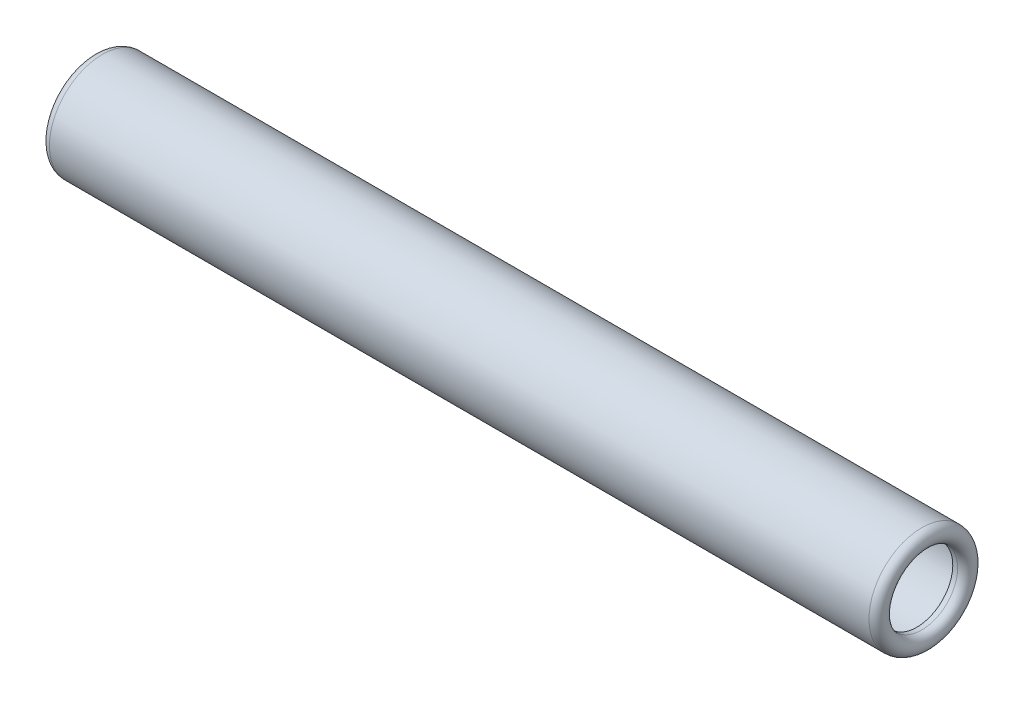
ISO-10303-21;
HEADER;
FILE_DESCRIPTION(('STEP AP214'),'2;1');
FILE_NAME('part.step','',(''),(''),'','','');
FILE_SCHEMA(('AUTOMOTIVE_DESIGN { 1 0 10303 214 1 1 1 1 }'));
ENDSEC;
DATA;
#1=APPLICATION_CONTEXT('core data for automotive mechanical design processes');
#2=APPLICATION_PROTOCOL_DEFINITION('international standard','automotive_design',2000,#1);
#3=PRODUCT_CONTEXT('',#1,'mechanical');
#4=PRODUCT('Part','Part','',(#3));
#5=PRODUCT_RELATED_PRODUCT_CATEGORY('part','',(#4));
#6=PRODUCT_DEFINITION_FORMATION('','',#4);
#7=PRODUCT_DEFINITION_CONTEXT('part definition',#1,'design');
#8=PRODUCT_DEFINITION('design','',#6,#7);
#9=PRODUCT_DEFINITION_SHAPE('','',#8);
#10=(LENGTH_UNIT() NAMED_UNIT(*) SI_UNIT(.MILLI.,.METRE.));
#11=(NAMED_UNIT(*) PLANE_ANGLE_UNIT() SI_UNIT($,.RADIAN.));
#12=(NAMED_UNIT(*) SI_UNIT($,.STERADIAN.) SOLID_ANGLE_UNIT());
#13=UNCERTAINTY_MEASURE_WITH_UNIT(LENGTH_MEASURE(1.E-05),#10,'distance_accuracy_value','');
#14=(GEOMETRIC_REPRESENTATION_CONTEXT(3) GLOBAL_UNCERTAINTY_ASSIGNED_CONTEXT((#13)) GLOBAL_UNIT_ASSIGNED_CONTEXT((#10,
#11,#12)) REPRESENTATION_CONTEXT('',''));
#15=CARTESIAN_POINT('',(0.,0.,0.));
#16=DIRECTION('',(0.,0.,1.));
#17=DIRECTION('',(1.,0.,0.));
#18=AXIS2_PLACEMENT_3D('',#15,#16,#17);
#19=CARTESIAN_POINT('',(298.95,0.,0.));
#20=DIRECTION('',(1.,0.,0.));
#21=DIRECTION('',(0.,1.,0.));
#22=AXIS2_PLACEMENT_3D('',#19,#20,#21);
#23=TOROIDAL_SURFACE('',#22,16.,3.05);
#24=CARTESIAN_POINT('',(298.95,0.,0.));
#25=DIRECTION('',(1.,0.,0.));
#26=DIRECTION('',(0.,1.,0.));
#27=AXIS2_PLACEMENT_3D('',#24,#25,#26);
#28=CIRCLE('',#27,19.05);
#29=CARTESIAN_POINT('',(298.95,19.05,0.));
#30=VERTEX_POINT('',#29);
#31=EDGE_CURVE('E73',#30,#30,#28,.T.);
#32=ORIENTED_EDGE('',*,*,#31,.T.);
#33=EDGE_LOOP('',(#32));
#34=FACE_BOUND('',#33,.T.);
#35=CARTESIAN_POINT('',(298.95,0.,0.));
#36=DIRECTION('',(1.,0.,0.));
#37=DIRECTION('',(0.,1.,0.));
#38=AXIS2_PLACEMENT_3D('',#35,#36,#37);
#39=CIRCLE('',#38,12.95);
#40=CARTESIAN_POINT('',(298.95,12.95,0.));
#41=VERTEX_POINT('',#40);
#42=EDGE_CURVE('E10',#41,#41,#39,.T.);
#43=ORIENTED_EDGE('',*,*,#42,.F.);
#44=EDGE_LOOP('',(#43));
#45=FACE_BOUND('',#44,.T.);
#46=ADVANCED_FACE('F33',(#34,#45),#23,.T.);
#47=CARTESIAN_POINT('',(307.5,0.,0.));
#48=DIRECTION('',(1.,0.,0.));
#49=DIRECTION('',(0.,1.,0.));
#50=AXIS2_PLACEMENT_3D('',#47,#48,#49);
#51=CYLINDRICAL_SURFACE('',#50,12.95);
#52=ORIENTED_EDGE('',*,*,#42,.T.);
#53=EDGE_LOOP('',(#52));
#54=FACE_BOUND('',#53,.T.);
#55=CARTESIAN_POINT('',(297.2,0.,0.));
#56=DIRECTION('',(1.,0.,0.));
#57=DIRECTION('',(0.,1.,0.));
#58=AXIS2_PLACEMENT_3D('',#55,#56,#57);
#59=CIRCLE('',#58,12.95);
#60=CARTESIAN_POINT('',(297.2,12.95,0.));
#61=VERTEX_POINT('',#60);
#62=EDGE_CURVE('E39',#61,#61,#59,.T.);
#63=ORIENTED_EDGE('',*,*,#62,.F.);
#64=EDGE_LOOP('',(#63));
#65=FACE_BOUND('',#64,.T.);
#66=ADVANCED_FACE('F91',(#54,#65),#51,.F.);
#67=CARTESIAN_POINT('',(297.2,12.95,0.));
#68=DIRECTION('',(-1.,0.,0.));
#69=DIRECTION('',(0.,-1.,0.));
#70=AXIS2_PLACEMENT_3D('',#67,#68,#69);
#71=PLANE('',#70);
#72=ORIENTED_EDGE('',*,*,#62,.T.);
#73=EDGE_LOOP('',(#72));
#74=FACE_BOUND('',#73,.T.);
#75=CARTESIAN_POINT('',(297.2,0.,0.));
#76=DIRECTION('',(1.,0.,0.));
#77=DIRECTION('',(0.,1.,0.));
#78=AXIS2_PLACEMENT_3D('',#75,#76,#77);
#79=CIRCLE('',#78,14.15);
#80=CARTESIAN_POINT('',(297.2,14.15,0.));
#81=VERTEX_POINT('',#80);
#82=EDGE_CURVE('E43',#81,#81,#79,.T.);
#83=ORIENTED_EDGE('',*,*,#82,.F.);
#84=EDGE_LOOP('',(#83));
#85=FACE_BOUND('',#84,.T.);
#86=ADVANCED_FACE('F95',(#74,#85),#71,.T.);
#87=CARTESIAN_POINT('',(307.5,0.,0.));
#88=DIRECTION('',(1.,0.,0.));
#89=DIRECTION('',(0.,1.,0.));
#90=AXIS2_PLACEMENT_3D('',#87,#88,#89);
#91=CYLINDRICAL_SURFACE('',#90,14.15);
#92=ORIENTED_EDGE('',*,*,#82,.T.);
#93=EDGE_LOOP('',(#92));
#94=FACE_BOUND('',#93,.T.);
#95=CARTESIAN_POINT('',(298.95,0.,0.));
#96=DIRECTION('',(1.,0.,0.));
#97=DIRECTION('',(0.,1.,0.));
#98=AXIS2_PLACEMENT_3D('',#95,#96,#97);
#99=CIRCLE('',#98,14.15);
#100=CARTESIAN_POINT('',(298.95,14.15,0.));
#101=VERTEX_POINT('',#100);
#102=EDGE_CURVE('E47',#101,#101,#99,.T.);
#103=ORIENTED_EDGE('',*,*,#102,.F.);
#104=EDGE_LOOP('',(#103));
#105=FACE_BOUND('',#104,.T.);
#106=ADVANCED_FACE('F99',(#94,#105),#91,.T.);
#107=CARTESIAN_POINT('',(298.95,0.,0.));
#108=DIRECTION('',(1.,0.,0.));
#109=DIRECTION('',(0.,1.,0.));
#110=AXIS2_PLACEMENT_3D('',#107,#108,#109);
#111=TOROIDAL_SURFACE('',#110,16.,1.85);
#112=ORIENTED_EDGE('',*,*,#102,.T.);
#113=EDGE_LOOP('',(#112));
#114=FACE_BOUND('',#113,.T.);
#115=CARTESIAN_POINT('',(298.95,0.,0.));
#116=DIRECTION('',(1.,0.,0.));
#117=DIRECTION('',(0.,1.,0.));
#118=AXIS2_PLACEMENT_3D('',#115,#116,#117);
#119=CIRCLE('',#118,17.85);
#120=CARTESIAN_POINT('',(298.95,17.85,0.));
#121=VERTEX_POINT('',#120);
#122=EDGE_CURVE('E52',#121,#121,#119,.T.);
#123=ORIENTED_EDGE('',*,*,#122,.F.);
#124=EDGE_LOOP('',(#123));
#125=FACE_BOUND('',#124,.T.);
#126=ADVANCED_FACE('F105',(#114,#125),#111,.F.);
#127=CARTESIAN_POINT('',(307.5,0.,0.));
#128=DIRECTION('',(1.,0.,0.));
#129=DIRECTION('',(0.,1.,0.));
#130=AXIS2_PLACEMENT_3D('',#127,#128,#129);
#131=CYLINDRICAL_SURFACE('',#130,17.85);
#132=ORIENTED_EDGE('',*,*,#122,.T.);
#133=EDGE_LOOP('',(#132));
#134=FACE_BOUND('',#133,.T.);
#135=CARTESIAN_POINT('',(3.05,0.,0.));
#136=DIRECTION('',(1.,0.,0.));
#137=DIRECTION('',(0.,1.,0.));
#138=AXIS2_PLACEMENT_3D('',#135,#136,#137);
#139=CIRCLE('',#138,17.85);
#140=CARTESIAN_POINT('',(3.04999999999999,17.85,0.));
#141=VERTEX_POINT('',#140);
#142=EDGE_CURVE('E55',#141,#141,#139,.T.);
#143=ORIENTED_EDGE('',*,*,#142,.F.);
#144=EDGE_LOOP('',(#143));
#145=FACE_BOUND('',#144,.T.);
#146=ADVANCED_FACE('F109',(#134,#145),#131,.F.);
#147=CARTESIAN_POINT('',(3.05,0.,0.));
#148=DIRECTION('',(1.,0.,0.));
#149=DIRECTION('',(0.,1.,0.));
#150=AXIS2_PLACEMENT_3D('',#147,#148,#149);
#151=TOROIDAL_SURFACE('',#150,16.,1.85);
#152=ORIENTED_EDGE('',*,*,#142,.T.);
#153=EDGE_LOOP('',(#152));
#154=FACE_BOUND('',#153,.T.);
#155=CARTESIAN_POINT('',(3.05,0.,0.));
#156=DIRECTION('',(1.,0.,0.));
#157=DIRECTION('',(0.,1.,0.));
#158=AXIS2_PLACEMENT_3D('',#155,#156,#157);
#159=CIRCLE('',#158,14.15);
#160=CARTESIAN_POINT('',(3.05,14.15,0.));
#161=VERTEX_POINT('',#160);
#162=EDGE_CURVE('E58',#161,#161,#159,.T.);
#163=ORIENTED_EDGE('',*,*,#162,.F.);
#164=EDGE_LOOP('',(#163));
#165=FACE_BOUND('',#164,.T.);
#166=ADVANCED_FACE('F113',(#154,#165),#151,.F.);
#167=CARTESIAN_POINT('',(307.5,0.,0.));
#168=DIRECTION('',(1.,0.,0.));
#169=DIRECTION('',(0.,1.,0.));
#170=AXIS2_PLACEMENT_3D('',#167,#168,#169);
#171=CYLINDRICAL_SURFACE('',#170,14.15);
#172=ORIENTED_EDGE('',*,*,#162,.T.);
#173=EDGE_LOOP('',(#172));
#174=FACE_BOUND('',#173,.T.);
#175=CARTESIAN_POINT('',(4.80000000000003,0.,0.));
#176=DIRECTION('',(1.,0.,0.));
#177=DIRECTION('',(0.,1.,0.));
#178=AXIS2_PLACEMENT_3D('',#175,#176,#177);
#179=CIRCLE('',#178,14.15);
#180=CARTESIAN_POINT('',(4.80000000000002,14.15,0.));
#181=VERTEX_POINT('',#180);
#182=EDGE_CURVE('E61',#181,#181,#179,.T.);
#183=ORIENTED_EDGE('',*,*,#182,.F.);
#184=EDGE_LOOP('',(#183));
#185=FACE_BOUND('',#184,.T.);
#186=ADVANCED_FACE('F117',(#174,#185),#171,.T.);
#187=CARTESIAN_POINT('',(4.8,12.95,0.));
#188=DIRECTION('',(1.,0.,0.));
#189=DIRECTION('',(0.,1.,0.));
#190=AXIS2_PLACEMENT_3D('',#187,#188,#189);
#191=PLANE('',#190);
#192=ORIENTED_EDGE('',*,*,#182,.T.);
#193=EDGE_LOOP('',(#192));
#194=FACE_BOUND('',#193,.T.);
#195=CARTESIAN_POINT('',(4.80000000000003,0.,0.));
#196=DIRECTION('',(1.,0.,0.));
#197=DIRECTION('',(0.,1.,0.));
#198=AXIS2_PLACEMENT_3D('',#195,#196,#197);
#199=CIRCLE('',#198,12.95);
#200=CARTESIAN_POINT('',(4.80000000000002,12.95,0.));
#201=VERTEX_POINT('',#200);
#202=EDGE_CURVE('E64',#201,#201,#199,.T.);
#203=ORIENTED_EDGE('',*,*,#202,.F.);
#204=EDGE_LOOP('',(#203));
#205=FACE_BOUND('',#204,.T.);
#206=ADVANCED_FACE('F121',(#194,#205),#191,.T.);
#207=CARTESIAN_POINT('',(307.5,0.,0.));
#208=DIRECTION('',(1.,0.,0.));
#209=DIRECTION('',(0.,1.,0.));
#210=AXIS2_PLACEMENT_3D('',#207,#208,#209);
#211=CYLINDRICAL_SURFACE('',#210,12.95);
#212=ORIENTED_EDGE('',*,*,#202,.T.);
#213=EDGE_LOOP('',(#212));
#214=FACE_BOUND('',#213,.T.);
#215=CARTESIAN_POINT('',(3.05,0.,0.));
#216=DIRECTION('',(1.,0.,0.));
#217=DIRECTION('',(0.,1.,0.));
#218=AXIS2_PLACEMENT_3D('',#215,#216,#217);
#219=CIRCLE('',#218,12.95);
#220=CARTESIAN_POINT('',(3.05,12.95,0.));
#221=VERTEX_POINT('',#220);
#222=EDGE_CURVE('E67',#221,#221,#219,.T.);
#223=ORIENTED_EDGE('',*,*,#222,.F.);
#224=EDGE_LOOP('',(#223));
#225=FACE_BOUND('',#224,.T.);
#226=ADVANCED_FACE('F87',(#214,#225),#211,.F.);
#227=CARTESIAN_POINT('',(3.05,0.,0.));
#228=DIRECTION('',(1.,0.,0.));
#229=DIRECTION('',(0.,1.,0.));
#230=AXIS2_PLACEMENT_3D('',#227,#228,#229);
#231=TOROIDAL_SURFACE('',#230,16.,3.05);
#232=ORIENTED_EDGE('',*,*,#222,.T.);
#233=EDGE_LOOP('',(#232));
#234=FACE_BOUND('',#233,.T.);
#235=CARTESIAN_POINT('',(3.05,0.,0.));
#236=DIRECTION('',(1.,0.,0.));
#237=DIRECTION('',(0.,1.,0.));
#238=AXIS2_PLACEMENT_3D('',#235,#236,#237);
#239=CIRCLE('',#238,19.05);
#240=CARTESIAN_POINT('',(3.04999999999999,19.05,0.));
#241=VERTEX_POINT('',#240);
#242=EDGE_CURVE('E70',#241,#241,#239,.T.);
#243=ORIENTED_EDGE('',*,*,#242,.F.);
#244=EDGE_LOOP('',(#243));
#245=FACE_BOUND('',#244,.T.);
#246=ADVANCED_FACE('F81',(#234,#245),#231,.T.);
#247=CARTESIAN_POINT('',(307.5,0.,0.));
#248=DIRECTION('',(1.,0.,0.));
#249=DIRECTION('',(0.,1.,0.));
#250=AXIS2_PLACEMENT_3D('',#247,#248,#249);
#251=CYLINDRICAL_SURFACE('',#250,19.05);
#252=ORIENTED_EDGE('',*,*,#242,.T.);
#253=EDGE_LOOP('',(#252));
#254=FACE_BOUND('',#253,.T.);
#255=ORIENTED_EDGE('',*,*,#31,.F.);
#256=EDGE_LOOP('',(#255));
#257=FACE_BOUND('',#256,.T.);
#258=ADVANCED_FACE('F79',(#254,#257),#251,.T.);
#259=CLOSED_SHELL('',(#46,#66,#86,#106,#126,#146,#166,#186,#206,#226,#246,#258));
#260=MANIFOLD_SOLID_BREP('B2',#259);
#261=ADVANCED_BREP_SHAPE_REPRESENTATION('',(#18,#260),#14);
#262=SHAPE_DEFINITION_REPRESENTATION(#9,#261);
ENDSEC;
END-ISO-10303-21;
